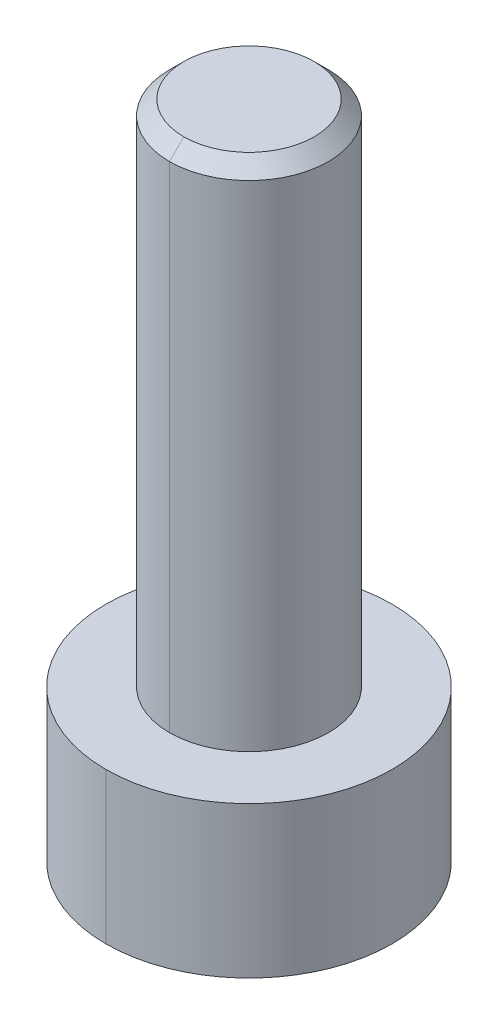
ISO-10303-21;
HEADER;
FILE_DESCRIPTION(('STEP AP214'),'2;1');
FILE_NAME('part.step','',(''),(''),'','','');
FILE_SCHEMA(('AUTOMOTIVE_DESIGN { 1 0 10303 214 1 1 1 1 }'));
ENDSEC;
DATA;
#1=APPLICATION_CONTEXT('core data for automotive mechanical design processes');
#2=APPLICATION_PROTOCOL_DEFINITION('international standard','automotive_design',2000,#1);
#3=PRODUCT_CONTEXT('',#1,'mechanical');
#4=PRODUCT('Part','Part','',(#3));
#5=PRODUCT_RELATED_PRODUCT_CATEGORY('part','',(#4));
#6=PRODUCT_DEFINITION_FORMATION('','',#4);
#7=PRODUCT_DEFINITION_CONTEXT('part definition',#1,'design');
#8=PRODUCT_DEFINITION('design','',#6,#7);
#9=PRODUCT_DEFINITION_SHAPE('','',#8);
#10=(LENGTH_UNIT() NAMED_UNIT(*) SI_UNIT(.MILLI.,.METRE.));
#11=(NAMED_UNIT(*) PLANE_ANGLE_UNIT() SI_UNIT($,.RADIAN.));
#12=(NAMED_UNIT(*) SI_UNIT($,.STERADIAN.) SOLID_ANGLE_UNIT());
#13=UNCERTAINTY_MEASURE_WITH_UNIT(LENGTH_MEASURE(1.E-05),#10,'distance_accuracy_value','');
#14=(GEOMETRIC_REPRESENTATION_CONTEXT(3) GLOBAL_UNCERTAINTY_ASSIGNED_CONTEXT((#13)) GLOBAL_UNIT_ASSIGNED_CONTEXT((#10,
#11,#12)) REPRESENTATION_CONTEXT('',''));
#15=CARTESIAN_POINT('',(0.,0.,0.));
#16=DIRECTION('',(0.,0.,1.));
#17=DIRECTION('',(1.,0.,0.));
#18=AXIS2_PLACEMENT_3D('',#15,#16,#17);
#19=CARTESIAN_POINT('',(0.,-1.25,0.));
#20=DIRECTION('',(0.,-1.,0.));
#21=DIRECTION('',(0.,0.,-1.));
#22=AXIS2_PLACEMENT_3D('',#19,#20,#21);
#23=PLANE('',#22);
#24=DIRECTION('',(-0.866025403784429,0.,0.500000000000017));
#25=VECTOR('',#24,1.);
#26=CARTESIAN_POINT('',(1.,-1.25,0.5773502691896));
#27=LINE('',#26,#25);
#28=CARTESIAN_POINT('',(1.,-1.25,0.5773502691896));
#29=VERTEX_POINT('',#28);
#30=CARTESIAN_POINT('',(0.,-1.25,1.15470053837905));
#31=VERTEX_POINT('',#30);
#32=EDGE_CURVE('E215',#29,#31,#27,.T.);
#33=ORIENTED_EDGE('',*,*,#32,.T.);
#34=DIRECTION('',(-0.866025403784429,0.,-0.500000000000017));
#35=VECTOR('',#34,1.);
#36=CARTESIAN_POINT('',(0.,-1.25,1.154700538379));
#37=LINE('',#36,#35);
#38=CARTESIAN_POINT('',(-0.999999999999945,-1.25,0.577350269189506));
#39=VERTEX_POINT('',#38);
#40=EDGE_CURVE('E11',#31,#39,#37,.T.);
#41=ORIENTED_EDGE('',*,*,#40,.T.);
#42=DIRECTION('',(0.,0.,-1.));
#43=VECTOR('',#42,1.);
#44=CARTESIAN_POINT('',(-1.,-1.25,0.5773502691896));
#45=LINE('',#44,#43);
#46=CARTESIAN_POINT('',(-1.,-1.25,-0.5773502691896));
#47=VERTEX_POINT('',#46);
#48=EDGE_CURVE('E189',#39,#47,#45,.T.);
#49=ORIENTED_EDGE('',*,*,#48,.T.);
#50=DIRECTION('',(0.866025403784429,0.,-0.500000000000017));
#51=VECTOR('',#50,1.);
#52=CARTESIAN_POINT('',(-1.,-1.25,-0.5773502691896));
#53=LINE('',#52,#51);
#54=CARTESIAN_POINT('',(0.,-1.25,-1.15470053837909));
#55=VERTEX_POINT('',#54);
#56=EDGE_CURVE('E190',#47,#55,#53,.T.);
#57=ORIENTED_EDGE('',*,*,#56,.T.);
#58=DIRECTION('',(0.866025403784429,0.,0.500000000000017));
#59=VECTOR('',#58,1.);
#60=CARTESIAN_POINT('',(0.,-1.25,-1.154700538379));
#61=LINE('',#60,#59);
#62=CARTESIAN_POINT('',(0.999999999999945,-1.25,-0.577350269189506));
#63=VERTEX_POINT('',#62);
#64=EDGE_CURVE('E140',#55,#63,#61,.T.);
#65=ORIENTED_EDGE('',*,*,#64,.T.);
#66=DIRECTION('',(0.,0.,1.));
#67=VECTOR('',#66,1.);
#68=CARTESIAN_POINT('',(1.,-1.25,-0.5773502691896));
#69=LINE('',#68,#67);
#70=EDGE_CURVE('E127',#63,#29,#69,.T.);
#71=ORIENTED_EDGE('',*,*,#70,.T.);
#72=EDGE_LOOP('',(#33,#41,#49,#57,#65,#71));
#73=FACE_BOUND('',#72,.T.);
#74=ADVANCED_FACE('F16',(#73),#23,.T.);
#75=CARTESIAN_POINT('',(0.,-2.5,1.154700538379));
#76=DIRECTION('',(-0.500000000000017,0.,0.866025403784429));
#77=DIRECTION('',(0.,1.,0.));
#78=AXIS2_PLACEMENT_3D('',#75,#76,#77);
#79=PLANE('',#78);
#80=ORIENTED_EDGE('',*,*,#40,.F.);
#81=DIRECTION('',(0.,-1.,0.));
#82=VECTOR('',#81,1.);
#83=CARTESIAN_POINT('',(1.08853898117545E-13,-2.5,1.15470053837919));
#84=LINE('',#83,#82);
#85=CARTESIAN_POINT('',(0.,-2.5,1.15470053837905));
#86=VERTEX_POINT('',#85);
#87=EDGE_CURVE('E214',#31,#86,#84,.T.);
#88=ORIENTED_EDGE('',*,*,#87,.T.);
#89=DIRECTION('',(-0.866025403784523,0.,-0.499999999999853));
#90=VECTOR('',#89,1.);
#91=CARTESIAN_POINT('',(0.,-2.5,1.154700538379));
#92=LINE('',#91,#90);
#93=CARTESIAN_POINT('',(-0.999999999999945,-2.5,0.577350269189506));
#94=VERTEX_POINT('',#93);
#95=EDGE_CURVE('E232',#86,#94,#92,.T.);
#96=ORIENTED_EDGE('',*,*,#95,.T.);
#97=DIRECTION('',(0.,1.,0.));
#98=VECTOR('',#97,1.);
#99=CARTESIAN_POINT('',(-1.,-2.5,0.5773502691896));
#100=LINE('',#99,#98);
#101=EDGE_CURVE('E27',#94,#39,#100,.T.);
#102=ORIENTED_EDGE('',*,*,#101,.T.);
#103=EDGE_LOOP('',(#80,#88,#96,#102));
#104=FACE_BOUND('',#103,.T.);
#105=ADVANCED_FACE('F335',(#104),#79,.F.);
#106=CARTESIAN_POINT('',(-1.,-2.5,0.5773502691896));
#107=DIRECTION('',(-1.,0.,0.));
#108=DIRECTION('',(0.,0.,1.));
#109=AXIS2_PLACEMENT_3D('',#106,#107,#108);
#110=PLANE('',#109);
#111=ORIENTED_EDGE('',*,*,#48,.F.);
#112=ORIENTED_EDGE('',*,*,#101,.F.);
#113=DIRECTION('',(0.,0.,-1.));
#114=VECTOR('',#113,1.);
#115=CARTESIAN_POINT('',(-1.,-2.5,0.));
#116=LINE('',#115,#114);
#117=CARTESIAN_POINT('',(-1.,-2.5,-0.5773502691896));
#118=VERTEX_POINT('',#117);
#119=EDGE_CURVE('E201',#94,#118,#116,.T.);
#120=ORIENTED_EDGE('',*,*,#119,.T.);
#121=DIRECTION('',(0.,1.,0.));
#122=VECTOR('',#121,1.);
#123=CARTESIAN_POINT('',(-1.,-2.5,-0.5773502691896));
#124=LINE('',#123,#122);
#125=EDGE_CURVE('E185',#118,#47,#124,.T.);
#126=ORIENTED_EDGE('',*,*,#125,.T.);
#127=EDGE_LOOP('',(#111,#112,#120,#126));
#128=FACE_BOUND('',#127,.T.);
#129=ADVANCED_FACE('F330',(#128),#110,.F.);
#130=CARTESIAN_POINT('',(-1.,-2.5,-0.5773502691896));
#131=DIRECTION('',(-0.500000000000017,0.,-0.866025403784429));
#132=DIRECTION('',(-0.866025403784429,0.,0.500000000000017));
#133=AXIS2_PLACEMENT_3D('',#130,#131,#132);
#134=PLANE('',#133);
#135=ORIENTED_EDGE('',*,*,#56,.F.);
#136=ORIENTED_EDGE('',*,*,#125,.F.);
#137=DIRECTION('',(0.866025403784523,0.,-0.499999999999853));
#138=VECTOR('',#137,1.);
#139=CARTESIAN_POINT('',(-1.,-2.5,-0.5773502691896));
#140=LINE('',#139,#138);
#141=CARTESIAN_POINT('',(0.,-2.5,-1.15470053837909));
#142=VERTEX_POINT('',#141);
#143=EDGE_CURVE('E197',#118,#142,#140,.T.);
#144=ORIENTED_EDGE('',*,*,#143,.T.);
#145=DIRECTION('',(0.,1.,0.));
#146=VECTOR('',#145,1.);
#147=CARTESIAN_POINT('',(0.,-2.5,-1.154700538379));
#148=LINE('',#147,#146);
#149=EDGE_CURVE('E243',#142,#55,#148,.T.);
#150=ORIENTED_EDGE('',*,*,#149,.T.);
#151=EDGE_LOOP('',(#135,#136,#144,#150));
#152=FACE_BOUND('',#151,.T.);
#153=ADVANCED_FACE('F334',(#152),#134,.F.);
#154=CARTESIAN_POINT('',(0.,-2.5,-1.154700538379));
#155=DIRECTION('',(0.500000000000017,0.,-0.866025403784429));
#156=DIRECTION('',(0.,-1.,0.));
#157=AXIS2_PLACEMENT_3D('',#154,#155,#156);
#158=PLANE('',#157);
#159=ORIENTED_EDGE('',*,*,#64,.F.);
#160=ORIENTED_EDGE('',*,*,#149,.F.);
#161=DIRECTION('',(0.866025403784523,0.,0.499999999999853));
#162=VECTOR('',#161,1.);
#163=CARTESIAN_POINT('',(0.,-2.5,-1.154700538379));
#164=LINE('',#163,#162);
#165=CARTESIAN_POINT('',(0.999999999999945,-2.5,-0.577350269189506));
#166=VERTEX_POINT('',#165);
#167=EDGE_CURVE('E202',#142,#166,#164,.T.);
#168=ORIENTED_EDGE('',*,*,#167,.T.);
#169=DIRECTION('',(0.,1.,0.));
#170=VECTOR('',#169,1.);
#171=CARTESIAN_POINT('',(1.,-2.5,-0.5773502691896));
#172=LINE('',#171,#170);
#173=EDGE_CURVE('E183',#166,#63,#172,.T.);
#174=ORIENTED_EDGE('',*,*,#173,.T.);
#175=EDGE_LOOP('',(#159,#160,#168,#174));
#176=FACE_BOUND('',#175,.T.);
#177=ADVANCED_FACE('F348',(#176),#158,.F.);
#178=CARTESIAN_POINT('',(1.,-2.5,-0.5773502691896));
#179=DIRECTION('',(1.,0.,0.));
#180=DIRECTION('',(0.,1.,0.));
#181=AXIS2_PLACEMENT_3D('',#178,#179,#180);
#182=PLANE('',#181);
#183=ORIENTED_EDGE('',*,*,#70,.F.);
#184=ORIENTED_EDGE('',*,*,#173,.F.);
#185=DIRECTION('',(0.,0.,1.));
#186=VECTOR('',#185,1.);
#187=CARTESIAN_POINT('',(1.,-2.5,0.));
#188=LINE('',#187,#186);
#189=CARTESIAN_POINT('',(1.,-2.5,0.5773502691896));
#190=VERTEX_POINT('',#189);
#191=EDGE_CURVE('E219',#166,#190,#188,.T.);
#192=ORIENTED_EDGE('',*,*,#191,.T.);
#193=DIRECTION('',(0.,1.,0.));
#194=VECTOR('',#193,1.);
#195=CARTESIAN_POINT('',(1.,-2.5,0.5773502691896));
#196=LINE('',#195,#194);
#197=EDGE_CURVE('E211',#190,#29,#196,.T.);
#198=ORIENTED_EDGE('',*,*,#197,.T.);
#199=EDGE_LOOP('',(#183,#184,#192,#198));
#200=FACE_BOUND('',#199,.T.);
#201=ADVANCED_FACE('F343',(#200),#182,.F.);
#202=CARTESIAN_POINT('',(1.,-2.5,0.5773502691896));
#203=DIRECTION('',(0.500000000000017,0.,0.866025403784429));
#204=DIRECTION('',(0.,-1.,0.));
#205=AXIS2_PLACEMENT_3D('',#202,#203,#204);
#206=PLANE('',#205);
#207=ORIENTED_EDGE('',*,*,#32,.F.);
#208=ORIENTED_EDGE('',*,*,#197,.F.);
#209=DIRECTION('',(-0.866025403784523,0.,0.499999999999853));
#210=VECTOR('',#209,1.);
#211=CARTESIAN_POINT('',(1.,-2.5,0.5773502691896));
#212=LINE('',#211,#210);
#213=EDGE_CURVE('E236',#190,#86,#212,.T.);
#214=ORIENTED_EDGE('',*,*,#213,.T.);
#215=ORIENTED_EDGE('',*,*,#87,.F.);
#216=EDGE_LOOP('',(#207,#208,#214,#215));
#217=FACE_BOUND('',#216,.T.);
#218=ADVANCED_FACE('F347',(#217),#206,.F.);
#219=CARTESIAN_POINT('',(0.,-2.5,0.));
#220=DIRECTION('',(0.,1.,0.));
#221=DIRECTION('',(1.,0.,0.));
#222=AXIS2_PLACEMENT_3D('',#219,#220,#221);
#223=PLANE('',#222);
#224=ORIENTED_EDGE('',*,*,#191,.F.);
#225=ORIENTED_EDGE('',*,*,#167,.F.);
#226=ORIENTED_EDGE('',*,*,#143,.F.);
#227=ORIENTED_EDGE('',*,*,#119,.F.);
#228=ORIENTED_EDGE('',*,*,#95,.F.);
#229=ORIENTED_EDGE('',*,*,#213,.F.);
#230=EDGE_LOOP('',(#224,#225,#226,#227,#228,#229));
#231=FACE_BOUND('',#230,.T.);
#232=CARTESIAN_POINT('',(0.,-2.49999999993209,0.));
#233=DIRECTION('',(0.,1.,0.));
#234=DIRECTION('',(0.,0.,1.));
#235=AXIS2_PLACEMENT_3D('',#232,#233,#234);
#236=CIRCLE('',#235,2.03349364903716);
#237=CARTESIAN_POINT('',(0.,-2.49999999993209,2.03349364903716));
#238=VERTEX_POINT('',#237);
#239=CARTESIAN_POINT('',(0.,-2.49999999993209,-2.03349364903716));
#240=VERTEX_POINT('',#239);
#241=EDGE_CURVE('E20',#238,#240,#236,.T.);
#242=ORIENTED_EDGE('',*,*,#241,.F.);
#243=CARTESIAN_POINT('',(0.,-2.49999999993209,0.));
#244=DIRECTION('',(0.,1.,0.));
#245=DIRECTION('',(0.,0.,1.));
#246=AXIS2_PLACEMENT_3D('',#243,#244,#245);
#247=CIRCLE('',#246,2.03349364903716);
#248=EDGE_CURVE('E230',#240,#238,#247,.T.);
#249=ORIENTED_EDGE('',*,*,#248,.F.);
#250=EDGE_LOOP('',(#242,#249));
#251=FACE_BOUND('',#250,.T.);
#252=ADVANCED_FACE('F18',(#231,#251),#223,.F.);
#253=CARTESIAN_POINT('',(0.,-2.37499999997226,0.));
#254=DIRECTION('',(0.,1.,0.));
#255=DIRECTION('',(0.,0.,1.));
#256=AXIS2_PLACEMENT_3D('',#253,#254,#255);
#257=CONICAL_SURFACE('',#256,2.24999999988995,1.04719755114913);
#258=DIRECTION('',(0.,0.500000000041109,-0.866025403760704));
#259=VECTOR('',#258,1.);
#260=CARTESIAN_POINT('',(0.,-2.37499999997226,-2.24999999988995));
#261=LINE('',#260,#259);
#262=CARTESIAN_POINT('',(0.,-2.37500000001,-2.24999999982459));
#263=VERTEX_POINT('',#262);
#264=EDGE_CURVE('E270',#240,#263,#261,.T.);
#265=ORIENTED_EDGE('',*,*,#264,.F.);
#266=ORIENTED_EDGE('',*,*,#248,.T.);
#267=DIRECTION('',(0.,0.500000000041109,0.866025403760704));
#268=VECTOR('',#267,1.);
#269=CARTESIAN_POINT('',(0.,-2.37499999997226,2.24999999988995));
#270=LINE('',#269,#268);
#271=CARTESIAN_POINT('',(0.,-2.37500000001,2.24999999982459));
#272=VERTEX_POINT('',#271);
#273=EDGE_CURVE('E165',#238,#272,#270,.T.);
#274=ORIENTED_EDGE('',*,*,#273,.T.);
#275=CARTESIAN_POINT('',(0.,-2.37500000001,0.));
#276=DIRECTION('',(0.,1.,0.));
#277=DIRECTION('',(0.,0.,1.));
#278=AXIS2_PLACEMENT_3D('',#275,#276,#277);
#279=CIRCLE('',#278,2.25);
#280=EDGE_CURVE('E227',#263,#272,#279,.T.);
#281=ORIENTED_EDGE('',*,*,#280,.F.);
#282=EDGE_LOOP('',(#265,#266,#274,#281));
#283=FACE_BOUND('',#282,.T.);
#284=ADVANCED_FACE('F322',(#283),#257,.T.);
#285=CARTESIAN_POINT('',(0.,-3.025,0.));
#286=DIRECTION('',(0.,1.,0.));
#287=DIRECTION('',(0.,0.,1.));
#288=AXIS2_PLACEMENT_3D('',#285,#286,#287);
#289=CYLINDRICAL_SURFACE('',#288,2.25);
#290=DIRECTION('',(0.,1.,0.));
#291=VECTOR('',#290,1.);
#292=CARTESIAN_POINT('',(0.,-3.025,-2.25));
#293=LINE('',#292,#291);
#294=CARTESIAN_POINT('',(0.,0.,-2.25));
#295=VERTEX_POINT('',#294);
#296=EDGE_CURVE('E191',#263,#295,#293,.T.);
#297=ORIENTED_EDGE('',*,*,#296,.F.);
#298=ORIENTED_EDGE('',*,*,#280,.T.);
#299=DIRECTION('',(0.,1.,0.));
#300=VECTOR('',#299,1.);
#301=CARTESIAN_POINT('',(0.,-3.025,2.25));
#302=LINE('',#301,#300);
#303=CARTESIAN_POINT('',(0.,0.,2.25));
#304=VERTEX_POINT('',#303);
#305=EDGE_CURVE('E223',#272,#304,#302,.T.);
#306=ORIENTED_EDGE('',*,*,#305,.T.);
#307=CARTESIAN_POINT('',(0.,0.,0.));
#308=DIRECTION('',(0.,1.,0.));
#309=DIRECTION('',(0.,0.,1.));
#310=AXIS2_PLACEMENT_3D('',#307,#308,#309);
#311=CIRCLE('',#310,2.25);
#312=EDGE_CURVE('E231',#295,#304,#311,.T.);
#313=ORIENTED_EDGE('',*,*,#312,.F.);
#314=EDGE_LOOP('',(#297,#298,#306,#313));
#315=FACE_BOUND('',#314,.T.);
#316=ADVANCED_FACE('F317',(#315),#289,.T.);
#317=CARTESIAN_POINT('',(0.,8.,0.));
#318=DIRECTION('',(0.,1.,0.));
#319=DIRECTION('',(1.,0.,0.));
#320=AXIS2_PLACEMENT_3D('',#317,#318,#319);
#321=PLANE('',#320);
#322=CARTESIAN_POINT('',(0.,7.99999999998136,0.));
#323=DIRECTION('',(0.,-1.,0.));
#324=DIRECTION('',(0.,0.,-1.));
#325=AXIS2_PLACEMENT_3D('',#322,#323,#324);
#326=CIRCLE('',#325,1.02500000008376);
#327=CARTESIAN_POINT('',(0.,7.99999999998136,-1.02500000008376));
#328=VERTEX_POINT('',#327);
#329=CARTESIAN_POINT('',(0.,7.99999999998136,1.02500000008376));
#330=VERTEX_POINT('',#329);
#331=EDGE_CURVE('E209',#328,#330,#326,.T.);
#332=ORIENTED_EDGE('',*,*,#331,.F.);
#333=CARTESIAN_POINT('',(0.,7.99999999998136,0.));
#334=DIRECTION('',(0.,-1.,0.));
#335=DIRECTION('',(0.,0.,-1.));
#336=AXIS2_PLACEMENT_3D('',#333,#334,#335);
#337=CIRCLE('',#336,1.02500000008376);
#338=EDGE_CURVE('E106',#330,#328,#337,.T.);
#339=ORIENTED_EDGE('',*,*,#338,.F.);
#340=EDGE_LOOP('',(#332,#339));
#341=FACE_BOUND('',#340,.T.);
#342=ADVANCED_FACE('F321',(#341),#321,.T.);
#343=CARTESIAN_POINT('',(0.,0.,0.));
#344=DIRECTION('',(0.,1.,0.));
#345=DIRECTION('',(1.,0.,0.));
#346=AXIS2_PLACEMENT_3D('',#343,#344,#345);
#347=PLANE('',#346);
#348=CARTESIAN_POINT('',(0.,0.,0.));
#349=DIRECTION('',(0.,1.,0.));
#350=DIRECTION('',(0.,0.,1.));
#351=AXIS2_PLACEMENT_3D('',#348,#349,#350);
#352=CIRCLE('',#351,1.25);
#353=CARTESIAN_POINT('',(0.,0.,1.25));
#354=VERTEX_POINT('',#353);
#355=CARTESIAN_POINT('',(0.,0.,-1.25));
#356=VERTEX_POINT('',#355);
#357=EDGE_CURVE('E159',#354,#356,#352,.T.);
#358=ORIENTED_EDGE('',*,*,#357,.F.);
#359=CARTESIAN_POINT('',(0.,0.,0.));
#360=DIRECTION('',(0.,1.,0.));
#361=DIRECTION('',(0.,0.,1.));
#362=AXIS2_PLACEMENT_3D('',#359,#360,#361);
#363=CIRCLE('',#362,1.25);
#364=EDGE_CURVE('E154',#356,#354,#363,.T.);
#365=ORIENTED_EDGE('',*,*,#364,.F.);
#366=EDGE_LOOP('',(#358,#365));
#367=FACE_BOUND('',#366,.T.);
#368=CARTESIAN_POINT('',(0.,0.,0.));
#369=DIRECTION('',(0.,1.,0.));
#370=DIRECTION('',(0.,0.,1.));
#371=AXIS2_PLACEMENT_3D('',#368,#369,#370);
#372=CIRCLE('',#371,2.25);
#373=EDGE_CURVE('E195',#304,#295,#372,.T.);
#374=ORIENTED_EDGE('',*,*,#373,.T.);
#375=ORIENTED_EDGE('',*,*,#312,.T.);
#376=EDGE_LOOP('',(#374,#375));
#377=FACE_BOUND('',#376,.T.);
#378=ADVANCED_FACE('F156',(#367,#377),#347,.T.);
#379=CARTESIAN_POINT('',(0.,7.77500000003784,0.));
#380=DIRECTION('',(0.,-1.,0.));
#381=DIRECTION('',(0.,0.,-1.));
#382=AXIS2_PLACEMENT_3D('',#379,#380,#381);
#383=CONICAL_SURFACE('',#382,1.24999999997044,0.785398163271129);
#384=DIRECTION('',(0.,-0.707106781275868,0.707106781097227));
#385=VECTOR('',#384,1.);
#386=CARTESIAN_POINT('',(0.,7.77500000003784,1.24999999997044));
#387=LINE('',#386,#385);
#388=CARTESIAN_POINT('',(0.,7.77500000001,1.24999999999828));
#389=VERTEX_POINT('',#388);
#390=EDGE_CURVE('E205',#330,#389,#387,.T.);
#391=ORIENTED_EDGE('',*,*,#390,.F.);
#392=ORIENTED_EDGE('',*,*,#338,.T.);
#393=DIRECTION('',(0.,-0.707106781275869,-0.707106781097227));
#394=VECTOR('',#393,1.);
#395=CARTESIAN_POINT('',(0.,7.77500000003784,-1.24999999997044));
#396=LINE('',#395,#394);
#397=CARTESIAN_POINT('',(0.,7.77500000001,-1.24999999999828));
#398=VERTEX_POINT('',#397);
#399=EDGE_CURVE('E208',#328,#398,#396,.T.);
#400=ORIENTED_EDGE('',*,*,#399,.T.);
#401=CARTESIAN_POINT('',(0.,7.77500000001,0.));
#402=DIRECTION('',(0.,-1.,0.));
#403=DIRECTION('',(0.,0.,1.));
#404=AXIS2_PLACEMENT_3D('',#401,#402,#403);
#405=CIRCLE('',#404,1.25);
#406=EDGE_CURVE('E164',#389,#398,#405,.T.);
#407=ORIENTED_EDGE('',*,*,#406,.F.);
#408=EDGE_LOOP('',(#391,#392,#400,#407));
#409=FACE_BOUND('',#408,.T.);
#410=ADVANCED_FACE('F385',(#409),#383,.T.);
#411=CARTESIAN_POINT('',(0.,-3.025,0.));
#412=DIRECTION('',(0.,1.,0.));
#413=DIRECTION('',(0.,0.,1.));
#414=AXIS2_PLACEMENT_3D('',#411,#412,#413);
#415=CYLINDRICAL_SURFACE('',#414,1.25);
#416=DIRECTION('',(0.,1.,0.));
#417=VECTOR('',#416,1.);
#418=CARTESIAN_POINT('',(0.,-3.025,-1.25));
#419=LINE('',#418,#417);
#420=EDGE_CURVE('E168',#356,#398,#419,.T.);
#421=ORIENTED_EDGE('',*,*,#420,.F.);
#422=ORIENTED_EDGE('',*,*,#364,.T.);
#423=DIRECTION('',(0.,1.,0.));
#424=VECTOR('',#423,1.);
#425=CARTESIAN_POINT('',(0.,-3.025,1.25));
#426=LINE('',#425,#424);
#427=EDGE_CURVE('E176',#354,#389,#426,.T.);
#428=ORIENTED_EDGE('',*,*,#427,.T.);
#429=ORIENTED_EDGE('',*,*,#406,.T.);
#430=EDGE_LOOP('',(#421,#422,#428,#429));
#431=FACE_BOUND('',#430,.T.);
#432=ADVANCED_FACE('F169',(#431),#415,.T.);
#433=CARTESIAN_POINT('',(0.,-2.37499999997226,0.));
#434=DIRECTION('',(0.,1.,0.));
#435=DIRECTION('',(0.,0.,1.));
#436=AXIS2_PLACEMENT_3D('',#433,#434,#435);
#437=CONICAL_SURFACE('',#436,2.24999999988995,1.04719755114913);
#438=ORIENTED_EDGE('',*,*,#241,.T.);
#439=ORIENTED_EDGE('',*,*,#264,.T.);
#440=CARTESIAN_POINT('',(0.,-2.37500000001,0.));
#441=DIRECTION('',(0.,1.,0.));
#442=DIRECTION('',(0.,0.,1.));
#443=AXIS2_PLACEMENT_3D('',#440,#441,#442);
#444=CIRCLE('',#443,2.25);
#445=EDGE_CURVE('E196',#272,#263,#444,.T.);
#446=ORIENTED_EDGE('',*,*,#445,.F.);
#447=ORIENTED_EDGE('',*,*,#273,.F.);
#448=EDGE_LOOP('',(#438,#439,#446,#447));
#449=FACE_BOUND('',#448,.T.);
#450=ADVANCED_FACE('F303',(#449),#437,.T.);
#451=CARTESIAN_POINT('',(0.,-3.025,0.));
#452=DIRECTION('',(0.,1.,0.));
#453=DIRECTION('',(0.,0.,1.));
#454=AXIS2_PLACEMENT_3D('',#451,#452,#453);
#455=CYLINDRICAL_SURFACE('',#454,2.25);
#456=ORIENTED_EDGE('',*,*,#445,.T.);
#457=ORIENTED_EDGE('',*,*,#296,.T.);
#458=ORIENTED_EDGE('',*,*,#373,.F.);
#459=ORIENTED_EDGE('',*,*,#305,.F.);
#460=EDGE_LOOP('',(#456,#457,#458,#459));
#461=FACE_BOUND('',#460,.T.);
#462=ADVANCED_FACE('F308',(#461),#455,.T.);
#463=CARTESIAN_POINT('',(0.,7.77500000003784,0.));
#464=DIRECTION('',(0.,-1.,0.));
#465=DIRECTION('',(0.,0.,-1.));
#466=AXIS2_PLACEMENT_3D('',#463,#464,#465);
#467=CONICAL_SURFACE('',#466,1.24999999997044,0.785398163271129);
#468=ORIENTED_EDGE('',*,*,#331,.T.);
#469=ORIENTED_EDGE('',*,*,#390,.T.);
#470=CARTESIAN_POINT('',(0.,7.77500000001,0.));
#471=DIRECTION('',(0.,-1.,0.));
#472=DIRECTION('',(0.,0.,1.));
#473=AXIS2_PLACEMENT_3D('',#470,#471,#472);
#474=CIRCLE('',#473,1.25);
#475=EDGE_CURVE('E173',#398,#389,#474,.T.);
#476=ORIENTED_EDGE('',*,*,#475,.F.);
#477=ORIENTED_EDGE('',*,*,#399,.F.);
#478=EDGE_LOOP('',(#468,#469,#476,#477));
#479=FACE_BOUND('',#478,.T.);
#480=ADVANCED_FACE('F378',(#479),#467,.T.);
#481=CARTESIAN_POINT('',(0.,-3.025,0.));
#482=DIRECTION('',(0.,1.,0.));
#483=DIRECTION('',(0.,0.,1.));
#484=AXIS2_PLACEMENT_3D('',#481,#482,#483);
#485=CYLINDRICAL_SURFACE('',#484,1.25);
#486=ORIENTED_EDGE('',*,*,#357,.T.);
#487=ORIENTED_EDGE('',*,*,#420,.T.);
#488=ORIENTED_EDGE('',*,*,#475,.T.);
#489=ORIENTED_EDGE('',*,*,#427,.F.);
#490=EDGE_LOOP('',(#486,#487,#488,#489));
#491=FACE_BOUND('',#490,.T.);
#492=ADVANCED_FACE('F175',(#491),#485,.T.);
#493=CLOSED_SHELL('',(#74,#105,#129,#153,#177,#201,#218,#252,#284,#316,#342,#378,#410,#432,#450,
#462,#480,#492));
#494=MANIFOLD_SOLID_BREP('B1',#493);
#495=ADVANCED_BREP_SHAPE_REPRESENTATION('',(#18,#494),#14);
#496=SHAPE_DEFINITION_REPRESENTATION(#9,#495);
ENDSEC;
END-ISO-10303-21;
